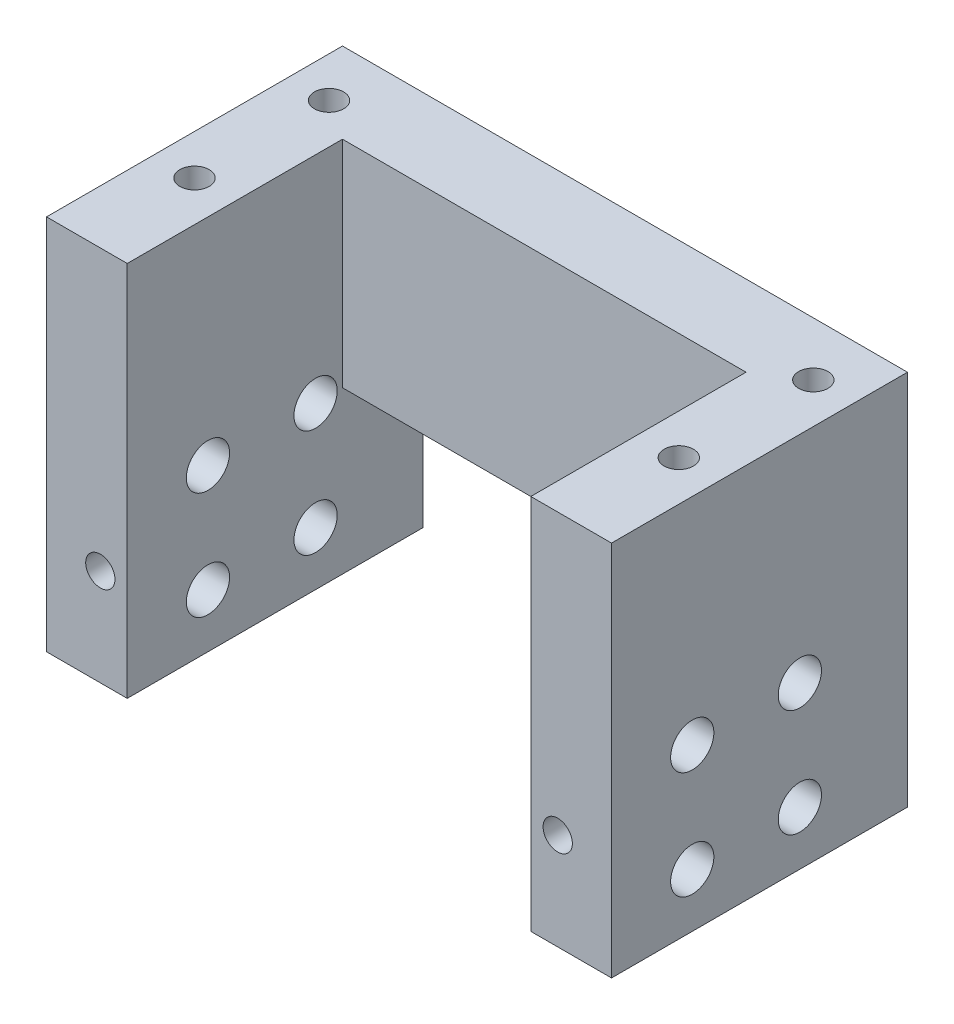
ISO-10303-21;
HEADER;
FILE_DESCRIPTION(('STEP AP214'),'2;1');
FILE_NAME('part.step','',(''),(''),'','','');
FILE_SCHEMA(('AUTOMOTIVE_DESIGN { 1 0 10303 214 1 1 1 1 }'));
ENDSEC;
DATA;
#1=APPLICATION_CONTEXT('core data for automotive mechanical design processes');
#2=APPLICATION_PROTOCOL_DEFINITION('international standard','automotive_design',2000,#1);
#3=PRODUCT_CONTEXT('',#1,'mechanical');
#4=PRODUCT('Part','Part','',(#3));
#5=PRODUCT_RELATED_PRODUCT_CATEGORY('part','',(#4));
#6=PRODUCT_DEFINITION_FORMATION('','',#4);
#7=PRODUCT_DEFINITION_CONTEXT('part definition',#1,'design');
#8=PRODUCT_DEFINITION('design','',#6,#7);
#9=PRODUCT_DEFINITION_SHAPE('','',#8);
#10=(LENGTH_UNIT() NAMED_UNIT(*) SI_UNIT(.MILLI.,.METRE.));
#11=(NAMED_UNIT(*) PLANE_ANGLE_UNIT() SI_UNIT($,.RADIAN.));
#12=(NAMED_UNIT(*) SI_UNIT($,.STERADIAN.) SOLID_ANGLE_UNIT());
#13=UNCERTAINTY_MEASURE_WITH_UNIT(LENGTH_MEASURE(1.E-05),#10,'distance_accuracy_value','');
#14=(GEOMETRIC_REPRESENTATION_CONTEXT(3) GLOBAL_UNCERTAINTY_ASSIGNED_CONTEXT((#13)) GLOBAL_UNIT_ASSIGNED_CONTEXT((#10,
#11,#12)) REPRESENTATION_CONTEXT('',''));
#15=CARTESIAN_POINT('',(0.,0.,0.));
#16=DIRECTION('',(0.,0.,1.));
#17=DIRECTION('',(1.,0.,0.));
#18=AXIS2_PLACEMENT_3D('',#15,#16,#17);
#19=CARTESIAN_POINT('',(-33.3375,-6.34999999999999,17.4625));
#20=DIRECTION('',(0.,1.,0.));
#21=DIRECTION('',(0.,0.,1.));
#22=AXIS2_PLACEMENT_3D('',#19,#20,#21);
#23=PLANE('',#22);
#24=DIRECTION('',(1.,0.,0.));
#25=VECTOR('',#24,1.);
#26=CARTESIAN_POINT('',(-33.3375,-6.34999999999999,-17.4625));
#27=LINE('',#26,#25);
#28=CARTESIAN_POINT('',(-33.3375,-6.34999999999999,-17.4625));
#29=VERTEX_POINT('',#28);
#30=CARTESIAN_POINT('',(-23.8125,-6.34999999999999,-17.4625));
#31=VERTEX_POINT('',#30);
#32=EDGE_CURVE('E257',#29,#31,#27,.T.);
#33=ORIENTED_EDGE('',*,*,#32,.T.);
#34=DIRECTION('',(0.,0.,-1.));
#35=VECTOR('',#34,1.);
#36=CARTESIAN_POINT('',(-23.8125,-6.34999999999999,17.4625));
#37=LINE('',#36,#35);
#38=CARTESIAN_POINT('',(-23.8125,-6.34999999999999,17.4625));
#39=VERTEX_POINT('',#38);
#40=EDGE_CURVE('E256',#39,#31,#37,.T.);
#41=ORIENTED_EDGE('',*,*,#40,.F.);
#42=DIRECTION('',(1.,0.,0.));
#43=VECTOR('',#42,1.);
#44=CARTESIAN_POINT('',(-33.3375,-6.34999999999999,17.4625));
#45=LINE('',#44,#43);
#46=CARTESIAN_POINT('',(-33.3375,-6.34999999999999,17.4625));
#47=VERTEX_POINT('',#46);
#48=EDGE_CURVE('E252',#47,#39,#45,.T.);
#49=ORIENTED_EDGE('',*,*,#48,.F.);
#50=DIRECTION('',(0.,0.,1.));
#51=VECTOR('',#50,1.);
#52=CARTESIAN_POINT('',(-33.3375,-6.34999999999999,17.4625));
#53=LINE('',#52,#51);
#54=EDGE_CURVE('E246',#29,#47,#53,.T.);
#55=ORIENTED_EDGE('',*,*,#54,.F.);
#56=EDGE_LOOP('',(#33,#41,#49,#55));
#57=FACE_BOUND('',#56,.T.);
#58=ADVANCED_FACE('F42',(#57),#23,.F.);
#59=CARTESIAN_POINT('',(-33.3375,38.1,17.4625));
#60=DIRECTION('',(0.,0.,-1.));
#61=DIRECTION('',(-1.,0.,0.));
#62=AXIS2_PLACEMENT_3D('',#59,#60,#61);
#63=PLANE('',#62);
#64=CARTESIAN_POINT('',(-26.9875,5.07999999999999,17.4625));
#65=DIRECTION('',(0.,0.,1.));
#66=DIRECTION('',(1.,0.,0.));
#67=AXIS2_PLACEMENT_3D('',#64,#65,#66);
#68=CIRCLE('',#67,1.72719999999999);
#69=CARTESIAN_POINT('',(-25.2603,5.07999999999999,17.4625));
#70=VERTEX_POINT('',#69);
#71=EDGE_CURVE('E161',#70,#70,#68,.T.);
#72=ORIENTED_EDGE('',*,*,#71,.F.);
#73=EDGE_LOOP('',(#72));
#74=FACE_BOUND('',#73,.T.);
#75=DIRECTION('',(0.,-1.,0.));
#76=VECTOR('',#75,1.);
#77=CARTESIAN_POINT('',(-33.3375,38.1,17.4625));
#78=LINE('',#77,#76);
#79=CARTESIAN_POINT('',(-33.3375,38.1,17.4625));
#80=VERTEX_POINT('',#79);
#81=EDGE_CURVE('E51',#80,#47,#78,.T.);
#82=ORIENTED_EDGE('',*,*,#81,.T.);
#83=ORIENTED_EDGE('',*,*,#48,.T.);
#84=DIRECTION('',(0.,1.,0.));
#85=VECTOR('',#84,1.);
#86=CARTESIAN_POINT('',(-23.8125,-38.1,17.4625));
#87=LINE('',#86,#85);
#88=CARTESIAN_POINT('',(-23.8125,38.1,17.4625));
#89=VERTEX_POINT('',#88);
#90=EDGE_CURVE('E275',#39,#89,#87,.T.);
#91=ORIENTED_EDGE('',*,*,#90,.T.);
#92=DIRECTION('',(1.,0.,0.));
#93=VECTOR('',#92,1.);
#94=CARTESIAN_POINT('',(-33.3375,38.1,17.4625));
#95=LINE('',#94,#93);
#96=EDGE_CURVE('E292',#80,#89,#95,.T.);
#97=ORIENTED_EDGE('',*,*,#96,.F.);
#98=EDGE_LOOP('',(#82,#83,#91,#97));
#99=FACE_BOUND('',#98,.T.);
#100=ADVANCED_FACE('F317',(#74,#99),#63,.F.);
#101=CARTESIAN_POINT('',(-33.3375,38.1,-17.4625));
#102=DIRECTION('',(1.,0.,0.));
#103=DIRECTION('',(0.,0.,-1.));
#104=AXIS2_PLACEMENT_3D('',#101,#102,#103);
#105=PLANE('',#104);
#106=CARTESIAN_POINT('',(-33.3375,12.7,7.9375));
#107=DIRECTION('',(-1.,0.,0.));
#108=DIRECTION('',(0.,0.,1.));
#109=AXIS2_PLACEMENT_3D('',#106,#107,#108);
#110=CIRCLE('',#109,2.55269999999999);
#111=CARTESIAN_POINT('',(-33.3375,12.7,10.4902));
#112=VERTEX_POINT('',#111);
#113=EDGE_CURVE('E361',#112,#112,#110,.T.);
#114=ORIENTED_EDGE('',*,*,#113,.F.);
#115=EDGE_LOOP('',(#114));
#116=FACE_BOUND('',#115,.T.);
#117=CARTESIAN_POINT('',(-33.3375,12.7,-4.7625));
#118=DIRECTION('',(-1.,0.,0.));
#119=DIRECTION('',(0.,0.,1.));
#120=AXIS2_PLACEMENT_3D('',#117,#118,#119);
#121=CIRCLE('',#120,2.55269999999999);
#122=CARTESIAN_POINT('',(-33.3375,12.7,-2.20980000000001));
#123=VERTEX_POINT('',#122);
#124=EDGE_CURVE('E356',#123,#123,#121,.T.);
#125=ORIENTED_EDGE('',*,*,#124,.F.);
#126=EDGE_LOOP('',(#125));
#127=FACE_BOUND('',#126,.T.);
#128=CARTESIAN_POINT('',(-33.3375,0.,7.9375));
#129=DIRECTION('',(-1.,0.,0.));
#130=DIRECTION('',(0.,0.,1.));
#131=AXIS2_PLACEMENT_3D('',#128,#129,#130);
#132=CIRCLE('',#131,2.55269999999999);
#133=CARTESIAN_POINT('',(-33.3375,0.,10.4902));
#134=VERTEX_POINT('',#133);
#135=EDGE_CURVE('E355',#134,#134,#132,.T.);
#136=ORIENTED_EDGE('',*,*,#135,.F.);
#137=EDGE_LOOP('',(#136));
#138=FACE_BOUND('',#137,.T.);
#139=CARTESIAN_POINT('',(-33.3375,0.,-4.7625));
#140=DIRECTION('',(-1.,0.,0.));
#141=DIRECTION('',(0.,0.,1.));
#142=AXIS2_PLACEMENT_3D('',#139,#140,#141);
#143=CIRCLE('',#142,2.55269999999999);
#144=CARTESIAN_POINT('',(-33.3375,0.,-2.20980000000001));
#145=VERTEX_POINT('',#144);
#146=EDGE_CURVE('E368',#145,#145,#143,.T.);
#147=ORIENTED_EDGE('',*,*,#146,.F.);
#148=EDGE_LOOP('',(#147));
#149=FACE_BOUND('',#148,.T.);
#150=DIRECTION('',(0.,-1.,0.));
#151=VECTOR('',#150,1.);
#152=CARTESIAN_POINT('',(-33.3375,38.1,-17.4625));
#153=LINE('',#152,#151);
#154=CARTESIAN_POINT('',(-33.3375,38.1,-17.4625));
#155=VERTEX_POINT('',#154);
#156=EDGE_CURVE('E302',#155,#29,#153,.T.);
#157=ORIENTED_EDGE('',*,*,#156,.T.);
#158=ORIENTED_EDGE('',*,*,#54,.T.);
#159=ORIENTED_EDGE('',*,*,#81,.F.);
#160=DIRECTION('',(0.,0.,1.));
#161=VECTOR('',#160,1.);
#162=CARTESIAN_POINT('',(-33.3375,38.1,-17.4625));
#163=LINE('',#162,#161);
#164=EDGE_CURVE('E279',#155,#80,#163,.T.);
#165=ORIENTED_EDGE('',*,*,#164,.F.);
#166=EDGE_LOOP('',(#157,#158,#159,#165));
#167=FACE_BOUND('',#166,.T.);
#168=ADVANCED_FACE('F44',(#116,#127,#138,#149,#167),#105,.F.);
#169=CARTESIAN_POINT('',(26.9875,5.07999999999999,17.4625));
#170=DIRECTION('',(0.,0.,1.));
#171=DIRECTION('',(1.,0.,0.));
#172=AXIS2_PLACEMENT_3D('',#169,#170,#171);
#173=CIRCLE('',#172,1.72719999999999);
#174=CARTESIAN_POINT('',(28.7147,5.07999999999999,17.4625));
#175=VERTEX_POINT('',#174);
#176=EDGE_CURVE('E200',#175,#175,#173,.T.);
#177=ORIENTED_EDGE('',*,*,#176,.F.);
#178=EDGE_LOOP('',(#177));
#179=FACE_BOUND('',#178,.T.);
#180=DIRECTION('',(0.,1.,0.));
#181=VECTOR('',#180,1.);
#182=CARTESIAN_POINT('',(23.8125,-38.1,17.4625));
#183=LINE('',#182,#181);
#184=CARTESIAN_POINT('',(23.8125,-6.35000000000001,17.4625));
#185=VERTEX_POINT('',#184);
#186=CARTESIAN_POINT('',(23.8125,38.1,17.4625));
#187=VERTEX_POINT('',#186);
#188=EDGE_CURVE('E283',#185,#187,#183,.T.);
#189=ORIENTED_EDGE('',*,*,#188,.F.);
#190=CARTESIAN_POINT('',(33.3375,-6.34999999999999,17.4625));
#191=VERTEX_POINT('',#190);
#192=EDGE_CURVE('E61',#185,#191,#45,.T.);
#193=ORIENTED_EDGE('',*,*,#192,.T.);
#194=DIRECTION('',(0.,-1.,0.));
#195=VECTOR('',#194,1.);
#196=CARTESIAN_POINT('',(33.3375,38.1,17.4625));
#197=LINE('',#196,#195);
#198=CARTESIAN_POINT('',(33.3375,38.1,17.4625));
#199=VERTEX_POINT('',#198);
#200=EDGE_CURVE('E310',#199,#191,#197,.T.);
#201=ORIENTED_EDGE('',*,*,#200,.F.);
#202=EDGE_CURVE('E291',#187,#199,#95,.T.);
#203=ORIENTED_EDGE('',*,*,#202,.F.);
#204=EDGE_LOOP('',(#189,#193,#201,#203));
#205=FACE_BOUND('',#204,.T.);
#206=ADVANCED_FACE('F348',(#179,#205),#63,.F.);
#207=CARTESIAN_POINT('',(33.3375,38.1,-17.4625));
#208=DIRECTION('',(-1.,0.,0.));
#209=DIRECTION('',(0.,0.,1.));
#210=AXIS2_PLACEMENT_3D('',#207,#208,#209);
#211=PLANE('',#210);
#212=CARTESIAN_POINT('',(33.3375,12.7,-4.7625));
#213=DIRECTION('',(1.,0.,0.));
#214=DIRECTION('',(0.,0.,-1.));
#215=AXIS2_PLACEMENT_3D('',#212,#213,#214);
#216=CIRCLE('',#215,2.55269999999999);
#217=CARTESIAN_POINT('',(33.3375,12.7,-7.31519999999999));
#218=VERTEX_POINT('',#217);
#219=EDGE_CURVE('E173',#218,#218,#216,.T.);
#220=ORIENTED_EDGE('',*,*,#219,.F.);
#221=EDGE_LOOP('',(#220));
#222=FACE_BOUND('',#221,.T.);
#223=CARTESIAN_POINT('',(33.3375,12.7,7.9375));
#224=DIRECTION('',(1.,0.,0.));
#225=DIRECTION('',(0.,0.,-1.));
#226=AXIS2_PLACEMENT_3D('',#223,#224,#225);
#227=CIRCLE('',#226,2.55269999999999);
#228=CARTESIAN_POINT('',(33.3375,12.7,5.38480000000001));
#229=VERTEX_POINT('',#228);
#230=EDGE_CURVE('E181',#229,#229,#227,.T.);
#231=ORIENTED_EDGE('',*,*,#230,.F.);
#232=EDGE_LOOP('',(#231));
#233=FACE_BOUND('',#232,.T.);
#234=CARTESIAN_POINT('',(33.3375,0.,7.9375));
#235=DIRECTION('',(1.,0.,0.));
#236=DIRECTION('',(0.,0.,-1.));
#237=AXIS2_PLACEMENT_3D('',#234,#235,#236);
#238=CIRCLE('',#237,2.55269999999999);
#239=CARTESIAN_POINT('',(33.3375,0.,5.38480000000001));
#240=VERTEX_POINT('',#239);
#241=EDGE_CURVE('E208',#240,#240,#238,.T.);
#242=ORIENTED_EDGE('',*,*,#241,.F.);
#243=EDGE_LOOP('',(#242));
#244=FACE_BOUND('',#243,.T.);
#245=CARTESIAN_POINT('',(33.3375,0.,-4.7625));
#246=DIRECTION('',(1.,0.,0.));
#247=DIRECTION('',(0.,0.,-1.));
#248=AXIS2_PLACEMENT_3D('',#245,#246,#247);
#249=CIRCLE('',#248,2.55269999999999);
#250=CARTESIAN_POINT('',(33.3375,0.,-7.31519999999998));
#251=VERTEX_POINT('',#250);
#252=EDGE_CURVE('E216',#251,#251,#249,.T.);
#253=ORIENTED_EDGE('',*,*,#252,.F.);
#254=EDGE_LOOP('',(#253));
#255=FACE_BOUND('',#254,.T.);
#256=ORIENTED_EDGE('',*,*,#200,.T.);
#257=DIRECTION('',(0.,0.,1.));
#258=VECTOR('',#257,1.);
#259=CARTESIAN_POINT('',(33.3375,-6.34999999999999,17.4625));
#260=LINE('',#259,#258);
#261=CARTESIAN_POINT('',(33.3375,-6.34999999999999,-17.4625));
#262=VERTEX_POINT('',#261);
#263=EDGE_CURVE('E245',#262,#191,#260,.T.);
#264=ORIENTED_EDGE('',*,*,#263,.F.);
#265=DIRECTION('',(0.,-1.,0.));
#266=VECTOR('',#265,1.);
#267=CARTESIAN_POINT('',(33.3375,38.1,-17.4625));
#268=LINE('',#267,#266);
#269=CARTESIAN_POINT('',(33.3375,38.1,-17.4625));
#270=VERTEX_POINT('',#269);
#271=EDGE_CURVE('E306',#270,#262,#268,.T.);
#272=ORIENTED_EDGE('',*,*,#271,.F.);
#273=DIRECTION('',(0.,0.,-1.));
#274=VECTOR('',#273,1.);
#275=CARTESIAN_POINT('',(33.3375,38.1,-17.4625));
#276=LINE('',#275,#274);
#277=EDGE_CURVE('E296',#199,#270,#276,.T.);
#278=ORIENTED_EDGE('',*,*,#277,.F.);
#279=EDGE_LOOP('',(#256,#264,#272,#278));
#280=FACE_BOUND('',#279,.T.);
#281=ADVANCED_FACE('F343',(#222,#233,#244,#255,#280),#211,.F.);
#282=CARTESIAN_POINT('',(-33.3375,38.1,-17.4625));
#283=DIRECTION('',(0.,0.,1.));
#284=DIRECTION('',(1.,0.,0.));
#285=AXIS2_PLACEMENT_3D('',#282,#283,#284);
#286=PLANE('',#285);
#287=DIRECTION('',(1.,0.,0.));
#288=VECTOR('',#287,1.);
#289=CARTESIAN_POINT('',(-23.8125,12.7,-17.4625));
#290=LINE('',#289,#288);
#291=CARTESIAN_POINT('',(-23.8125,12.7,-17.4625));
#292=VERTEX_POINT('',#291);
#293=CARTESIAN_POINT('',(23.8125,12.7,-17.4625));
#294=VERTEX_POINT('',#293);
#295=EDGE_CURVE('E228',#292,#294,#290,.T.);
#296=ORIENTED_EDGE('',*,*,#295,.F.);
#297=DIRECTION('',(0.,1.,0.));
#298=VECTOR('',#297,1.);
#299=CARTESIAN_POINT('',(-23.8125,12.7,-17.4625));
#300=LINE('',#299,#298);
#301=EDGE_CURVE('E224',#31,#292,#300,.T.);
#302=ORIENTED_EDGE('',*,*,#301,.F.);
#303=ORIENTED_EDGE('',*,*,#32,.F.);
#304=ORIENTED_EDGE('',*,*,#156,.F.);
#305=DIRECTION('',(-1.,0.,0.));
#306=VECTOR('',#305,1.);
#307=CARTESIAN_POINT('',(-33.3375,38.1,-17.4625));
#308=LINE('',#307,#306);
#309=EDGE_CURVE('E299',#270,#155,#308,.T.);
#310=ORIENTED_EDGE('',*,*,#309,.F.);
#311=ORIENTED_EDGE('',*,*,#271,.T.);
#312=CARTESIAN_POINT('',(23.8125,-6.34999999999999,-17.4625));
#313=VERTEX_POINT('',#312);
#314=EDGE_CURVE('E249',#313,#262,#27,.T.);
#315=ORIENTED_EDGE('',*,*,#314,.F.);
#316=DIRECTION('',(0.,-1.,0.));
#317=VECTOR('',#316,1.);
#318=CARTESIAN_POINT('',(23.8125,12.7,-17.4625));
#319=LINE('',#318,#317);
#320=EDGE_CURVE('E232',#294,#313,#319,.T.);
#321=ORIENTED_EDGE('',*,*,#320,.F.);
#322=EDGE_LOOP('',(#296,#302,#303,#304,#310,#311,#315,#321));
#323=FACE_BOUND('',#322,.T.);
#324=ADVANCED_FACE('F327',(#323),#286,.F.);
#325=CARTESIAN_POINT('',(0.,38.1,0.));
#326=DIRECTION('',(0.,1.,0.));
#327=DIRECTION('',(0.,0.,1.));
#328=AXIS2_PLACEMENT_3D('',#325,#326,#327);
#329=PLANE('',#328);
#330=CARTESIAN_POINT('',(-28.575,38.1,4.7625));
#331=DIRECTION('',(0.,1.,0.));
#332=DIRECTION('',(0.,0.,1.));
#333=AXIS2_PLACEMENT_3D('',#330,#331,#332);
#334=CIRCLE('',#333,1.72719999999999);
#335=CARTESIAN_POINT('',(-28.575,38.1,6.48969999999999));
#336=VERTEX_POINT('',#335);
#337=EDGE_CURVE('E144',#336,#336,#334,.T.);
#338=ORIENTED_EDGE('',*,*,#337,.F.);
#339=EDGE_LOOP('',(#338));
#340=FACE_BOUND('',#339,.T.);
#341=CARTESIAN_POINT('',(-28.575,38.1,-11.1125));
#342=DIRECTION('',(0.,1.,0.));
#343=DIRECTION('',(0.,0.,1.));
#344=AXIS2_PLACEMENT_3D('',#341,#342,#343);
#345=CIRCLE('',#344,1.72719999999999);
#346=CARTESIAN_POINT('',(-28.575,38.1,-9.38530000000001));
#347=VERTEX_POINT('',#346);
#348=EDGE_CURVE('E143',#347,#347,#345,.T.);
#349=ORIENTED_EDGE('',*,*,#348,.F.);
#350=EDGE_LOOP('',(#349));
#351=FACE_BOUND('',#350,.T.);
#352=CARTESIAN_POINT('',(28.575,38.1,4.7625));
#353=DIRECTION('',(0.,1.,0.));
#354=DIRECTION('',(0.,0.,1.));
#355=AXIS2_PLACEMENT_3D('',#352,#353,#354);
#356=CIRCLE('',#355,1.72719999999999);
#357=CARTESIAN_POINT('',(28.575,38.1,6.48969999999999));
#358=VERTEX_POINT('',#357);
#359=EDGE_CURVE('E185',#358,#358,#356,.T.);
#360=ORIENTED_EDGE('',*,*,#359,.F.);
#361=EDGE_LOOP('',(#360));
#362=FACE_BOUND('',#361,.T.);
#363=CARTESIAN_POINT('',(28.575,38.1,-11.1125));
#364=DIRECTION('',(0.,1.,0.));
#365=DIRECTION('',(0.,0.,1.));
#366=AXIS2_PLACEMENT_3D('',#363,#364,#365);
#367=CIRCLE('',#366,1.72719999999999);
#368=CARTESIAN_POINT('',(28.575,38.1,-9.38530000000001));
#369=VERTEX_POINT('',#368);
#370=EDGE_CURVE('E193',#369,#369,#367,.T.);
#371=ORIENTED_EDGE('',*,*,#370,.F.);
#372=EDGE_LOOP('',(#371));
#373=FACE_BOUND('',#372,.T.);
#374=DIRECTION('',(0.,0.,1.));
#375=VECTOR('',#374,1.);
#376=CARTESIAN_POINT('',(-23.8125,38.1,17.4625));
#377=LINE('',#376,#375);
#378=CARTESIAN_POINT('',(-23.8125,38.1,-7.9375));
#379=VERTEX_POINT('',#378);
#380=EDGE_CURVE('E263',#379,#89,#377,.T.);
#381=ORIENTED_EDGE('',*,*,#380,.F.);
#382=DIRECTION('',(-1.,0.,0.));
#383=VECTOR('',#382,1.);
#384=CARTESIAN_POINT('',(-23.8125,38.1,-7.9375));
#385=LINE('',#384,#383);
#386=CARTESIAN_POINT('',(23.8125,38.1,-7.9375));
#387=VERTEX_POINT('',#386);
#388=EDGE_CURVE('E271',#387,#379,#385,.T.);
#389=ORIENTED_EDGE('',*,*,#388,.F.);
#390=DIRECTION('',(0.,0.,-1.));
#391=VECTOR('',#390,1.);
#392=CARTESIAN_POINT('',(23.8125,38.1,17.4625));
#393=LINE('',#392,#391);
#394=EDGE_CURVE('E267',#187,#387,#393,.T.);
#395=ORIENTED_EDGE('',*,*,#394,.F.);
#396=ORIENTED_EDGE('',*,*,#202,.T.);
#397=ORIENTED_EDGE('',*,*,#277,.T.);
#398=ORIENTED_EDGE('',*,*,#309,.T.);
#399=ORIENTED_EDGE('',*,*,#164,.T.);
#400=ORIENTED_EDGE('',*,*,#96,.T.);
#401=EDGE_LOOP('',(#381,#389,#395,#396,#397,#398,#399,#400));
#402=FACE_BOUND('',#401,.T.);
#403=ADVANCED_FACE('F337',(#340,#351,#362,#373,#402),#329,.T.);
#404=CARTESIAN_POINT('',(-23.8125,-38.1,17.4625));
#405=DIRECTION('',(-1.,0.,0.));
#406=DIRECTION('',(0.,0.,1.));
#407=AXIS2_PLACEMENT_3D('',#404,#405,#406);
#408=PLANE('',#407);
#409=CARTESIAN_POINT('',(-23.8125,12.7,7.9375));
#410=DIRECTION('',(-1.,0.,0.));
#411=DIRECTION('',(0.,0.,1.));
#412=AXIS2_PLACEMENT_3D('',#409,#410,#411);
#413=CIRCLE('',#412,2.55269999999999);
#414=CARTESIAN_POINT('',(-23.8125,12.7,10.4902));
#415=VERTEX_POINT('',#414);
#416=EDGE_CURVE('E359',#415,#415,#413,.T.);
#417=ORIENTED_EDGE('',*,*,#416,.T.);
#418=EDGE_LOOP('',(#417));
#419=FACE_BOUND('',#418,.T.);
#420=CARTESIAN_POINT('',(-23.8125,12.7,-4.7625));
#421=DIRECTION('',(-1.,0.,0.));
#422=DIRECTION('',(0.,0.,1.));
#423=AXIS2_PLACEMENT_3D('',#420,#421,#422);
#424=CIRCLE('',#423,2.55269999999999);
#425=CARTESIAN_POINT('',(-23.8125,12.7,-2.20980000000001));
#426=VERTEX_POINT('',#425);
#427=EDGE_CURVE('E353',#426,#426,#424,.T.);
#428=ORIENTED_EDGE('',*,*,#427,.T.);
#429=EDGE_LOOP('',(#428));
#430=FACE_BOUND('',#429,.T.);
#431=CARTESIAN_POINT('',(-23.8125,0.,7.9375));
#432=DIRECTION('',(-1.,0.,0.));
#433=DIRECTION('',(0.,0.,1.));
#434=AXIS2_PLACEMENT_3D('',#431,#432,#433);
#435=CIRCLE('',#434,2.55269999999999);
#436=CARTESIAN_POINT('',(-23.8125,0.,10.4902));
#437=VERTEX_POINT('',#436);
#438=EDGE_CURVE('E371',#437,#437,#435,.T.);
#439=ORIENTED_EDGE('',*,*,#438,.T.);
#440=EDGE_LOOP('',(#439));
#441=FACE_BOUND('',#440,.T.);
#442=CARTESIAN_POINT('',(-23.8125,0.,-4.7625));
#443=DIRECTION('',(-1.,0.,0.));
#444=DIRECTION('',(0.,0.,1.));
#445=AXIS2_PLACEMENT_3D('',#442,#443,#444);
#446=CIRCLE('',#445,2.55269999999999);
#447=CARTESIAN_POINT('',(-23.8125,0.,-2.20980000000001));
#448=VERTEX_POINT('',#447);
#449=EDGE_CURVE('E154',#448,#448,#446,.T.);
#450=ORIENTED_EDGE('',*,*,#449,.T.);
#451=EDGE_LOOP('',(#450));
#452=FACE_BOUND('',#451,.T.);
#453=ORIENTED_EDGE('',*,*,#380,.T.);
#454=ORIENTED_EDGE('',*,*,#90,.F.);
#455=ORIENTED_EDGE('',*,*,#40,.T.);
#456=ORIENTED_EDGE('',*,*,#301,.T.);
#457=DIRECTION('',(0.,0.,-1.));
#458=VECTOR('',#457,1.);
#459=CARTESIAN_POINT('',(-23.8125,12.7,17.4625));
#460=LINE('',#459,#458);
#461=CARTESIAN_POINT('',(-23.8125,12.7,-7.9375));
#462=VERTEX_POINT('',#461);
#463=EDGE_CURVE('E235',#462,#292,#460,.T.);
#464=ORIENTED_EDGE('',*,*,#463,.F.);
#465=DIRECTION('',(0.,1.,0.));
#466=VECTOR('',#465,1.);
#467=CARTESIAN_POINT('',(-23.8125,-38.1,-7.9375));
#468=LINE('',#467,#466);
#469=EDGE_CURVE('E276',#462,#379,#468,.T.);
#470=ORIENTED_EDGE('',*,*,#469,.T.);
#471=EDGE_LOOP('',(#453,#454,#455,#456,#464,#470));
#472=FACE_BOUND('',#471,.T.);
#473=ADVANCED_FACE('F332',(#419,#430,#441,#452,#472),#408,.F.);
#474=CARTESIAN_POINT('',(-23.8125,-38.1,-7.9375));
#475=DIRECTION('',(0.,0.,-1.));
#476=DIRECTION('',(-1.,0.,0.));
#477=AXIS2_PLACEMENT_3D('',#474,#475,#476);
#478=PLANE('',#477);
#479=ORIENTED_EDGE('',*,*,#469,.F.);
#480=DIRECTION('',(1.,0.,0.));
#481=VECTOR('',#480,1.);
#482=CARTESIAN_POINT('',(-23.8125,12.7,-7.9375));
#483=LINE('',#482,#481);
#484=CARTESIAN_POINT('',(23.8125,12.7,-7.9375));
#485=VERTEX_POINT('',#484);
#486=EDGE_CURVE('E239',#462,#485,#483,.T.);
#487=ORIENTED_EDGE('',*,*,#486,.T.);
#488=DIRECTION('',(0.,1.,0.));
#489=VECTOR('',#488,1.);
#490=CARTESIAN_POINT('',(23.8125,-38.1,-7.9375));
#491=LINE('',#490,#489);
#492=EDGE_CURVE('E280',#485,#387,#491,.T.);
#493=ORIENTED_EDGE('',*,*,#492,.T.);
#494=ORIENTED_EDGE('',*,*,#388,.T.);
#495=EDGE_LOOP('',(#479,#487,#493,#494));
#496=FACE_BOUND('',#495,.T.);
#497=ADVANCED_FACE('F426',(#496),#478,.F.);
#498=CARTESIAN_POINT('',(23.8125,-38.1,17.4625));
#499=DIRECTION('',(1.,0.,0.));
#500=DIRECTION('',(0.,0.,-1.));
#501=AXIS2_PLACEMENT_3D('',#498,#499,#500);
#502=PLANE('',#501);
#503=CARTESIAN_POINT('',(23.8125,12.7,-4.7625));
#504=DIRECTION('',(1.,0.,0.));
#505=DIRECTION('',(0.,0.,-1.));
#506=AXIS2_PLACEMENT_3D('',#503,#504,#505);
#507=CIRCLE('',#506,2.55269999999999);
#508=CARTESIAN_POINT('',(23.8125,12.7,-7.31519999999999));
#509=VERTEX_POINT('',#508);
#510=EDGE_CURVE('E169',#509,#509,#507,.T.);
#511=ORIENTED_EDGE('',*,*,#510,.T.);
#512=EDGE_LOOP('',(#511));
#513=FACE_BOUND('',#512,.T.);
#514=CARTESIAN_POINT('',(23.8125,12.7,7.9375));
#515=DIRECTION('',(1.,0.,0.));
#516=DIRECTION('',(0.,0.,-1.));
#517=AXIS2_PLACEMENT_3D('',#514,#515,#516);
#518=CIRCLE('',#517,2.55269999999999);
#519=CARTESIAN_POINT('',(23.8125,12.7,5.38480000000001));
#520=VERTEX_POINT('',#519);
#521=EDGE_CURVE('E177',#520,#520,#518,.T.);
#522=ORIENTED_EDGE('',*,*,#521,.T.);
#523=EDGE_LOOP('',(#522));
#524=FACE_BOUND('',#523,.T.);
#525=CARTESIAN_POINT('',(23.8125,0.,7.9375));
#526=DIRECTION('',(1.,0.,0.));
#527=DIRECTION('',(0.,0.,-1.));
#528=AXIS2_PLACEMENT_3D('',#525,#526,#527);
#529=CIRCLE('',#528,2.55269999999999);
#530=CARTESIAN_POINT('',(23.8125,0.,5.38480000000001));
#531=VERTEX_POINT('',#530);
#532=EDGE_CURVE('E212',#531,#531,#529,.T.);
#533=ORIENTED_EDGE('',*,*,#532,.T.);
#534=EDGE_LOOP('',(#533));
#535=FACE_BOUND('',#534,.T.);
#536=CARTESIAN_POINT('',(23.8125,0.,-4.7625));
#537=DIRECTION('',(1.,0.,0.));
#538=DIRECTION('',(0.,0.,-1.));
#539=AXIS2_PLACEMENT_3D('',#536,#537,#538);
#540=CIRCLE('',#539,2.55269999999999);
#541=CARTESIAN_POINT('',(23.8125,0.,-7.31519999999999));
#542=VERTEX_POINT('',#541);
#543=EDGE_CURVE('E220',#542,#542,#540,.T.);
#544=ORIENTED_EDGE('',*,*,#543,.T.);
#545=EDGE_LOOP('',(#544));
#546=FACE_BOUND('',#545,.T.);
#547=ORIENTED_EDGE('',*,*,#492,.F.);
#548=DIRECTION('',(0.,0.,-1.));
#549=VECTOR('',#548,1.);
#550=CARTESIAN_POINT('',(23.8125,12.7,17.4625));
#551=LINE('',#550,#549);
#552=EDGE_CURVE('E236',#485,#294,#551,.T.);
#553=ORIENTED_EDGE('',*,*,#552,.T.);
#554=ORIENTED_EDGE('',*,*,#320,.T.);
#555=DIRECTION('',(0.,0.,1.));
#556=VECTOR('',#555,1.);
#557=CARTESIAN_POINT('',(23.8125,-6.34999999999999,17.4625));
#558=LINE('',#557,#556);
#559=EDGE_CURVE('E11',#313,#185,#558,.T.);
#560=ORIENTED_EDGE('',*,*,#559,.T.);
#561=ORIENTED_EDGE('',*,*,#188,.T.);
#562=ORIENTED_EDGE('',*,*,#394,.T.);
#563=EDGE_LOOP('',(#547,#553,#554,#560,#561,#562));
#564=FACE_BOUND('',#563,.T.);
#565=ADVANCED_FACE('F419',(#513,#524,#535,#546,#564),#502,.F.);
#566=ORIENTED_EDGE('',*,*,#559,.F.);
#567=ORIENTED_EDGE('',*,*,#314,.T.);
#568=ORIENTED_EDGE('',*,*,#263,.T.);
#569=ORIENTED_EDGE('',*,*,#192,.F.);
#570=EDGE_LOOP('',(#566,#567,#568,#569));
#571=FACE_BOUND('',#570,.T.);
#572=ADVANCED_FACE('F345',(#571),#23,.F.);
#573=CARTESIAN_POINT('',(-23.8125,12.7,17.4625));
#574=DIRECTION('',(0.,1.,0.));
#575=DIRECTION('',(-1.,0.,0.));
#576=AXIS2_PLACEMENT_3D('',#573,#574,#575);
#577=PLANE('',#576);
#578=ORIENTED_EDGE('',*,*,#463,.T.);
#579=ORIENTED_EDGE('',*,*,#295,.T.);
#580=ORIENTED_EDGE('',*,*,#552,.F.);
#581=ORIENTED_EDGE('',*,*,#486,.F.);
#582=EDGE_LOOP('',(#578,#579,#580,#581));
#583=FACE_BOUND('',#582,.T.);
#584=ADVANCED_FACE('F418',(#583),#577,.F.);
#585=CARTESIAN_POINT('',(33.3375,0.,-4.7625));
#586=DIRECTION('',(1.,0.,0.));
#587=DIRECTION('',(0.,0.,-1.));
#588=AXIS2_PLACEMENT_3D('',#585,#586,#587);
#589=CYLINDRICAL_SURFACE('',#588,2.55269999999999);
#590=ORIENTED_EDGE('',*,*,#543,.F.);
#591=EDGE_LOOP('',(#590));
#592=FACE_BOUND('',#591,.T.);
#593=ORIENTED_EDGE('',*,*,#252,.T.);
#594=EDGE_LOOP('',(#593));
#595=FACE_BOUND('',#594,.T.);
#596=ADVANCED_FACE('F424',(#592,#595),#589,.F.);
#597=CARTESIAN_POINT('',(33.3375,0.,7.9375));
#598=DIRECTION('',(1.,0.,0.));
#599=DIRECTION('',(0.,0.,-1.));
#600=AXIS2_PLACEMENT_3D('',#597,#598,#599);
#601=CYLINDRICAL_SURFACE('',#600,2.55269999999999);
#602=ORIENTED_EDGE('',*,*,#532,.F.);
#603=EDGE_LOOP('',(#602));
#604=FACE_BOUND('',#603,.T.);
#605=ORIENTED_EDGE('',*,*,#241,.T.);
#606=EDGE_LOOP('',(#605));
#607=FACE_BOUND('',#606,.T.);
#608=ADVANCED_FACE('F464',(#604,#607),#601,.F.);
#609=CARTESIAN_POINT('',(26.9875,5.07999999999999,5.0165));
#610=DIRECTION('',(0.,0.,1.));
#611=DIRECTION('',(1.,0.,0.));
#612=AXIS2_PLACEMENT_3D('',#609,#610,#611);
#613=CONICAL_SURFACE('',#612,1.72719999999999,1.02974425867665);
#614=CARTESIAN_POINT('',(26.9875,5.07999999999999,3.9786935388156));
#615=VERTEX_POINT('',#614);
#616=VERTEX_LOOP('',#615);
#617=FACE_BOUND('',#616,.T.);
#618=CARTESIAN_POINT('',(26.9875,5.07999999999999,5.0165));
#619=DIRECTION('',(0.,0.,1.));
#620=DIRECTION('',(1.,0.,0.));
#621=AXIS2_PLACEMENT_3D('',#618,#619,#620);
#622=CIRCLE('',#621,1.72719999999999);
#623=CARTESIAN_POINT('',(28.7147,5.07999999999999,5.0165));
#624=VERTEX_POINT('',#623);
#625=EDGE_CURVE('E204',#624,#624,#622,.T.);
#626=ORIENTED_EDGE('',*,*,#625,.T.);
#627=EDGE_LOOP('',(#626));
#628=FACE_BOUND('',#627,.T.);
#629=ADVANCED_FACE('F454',(#617,#628),#613,.F.);
#630=CARTESIAN_POINT('',(26.9875,5.07999999999999,17.4625));
#631=DIRECTION('',(0.,0.,1.));
#632=DIRECTION('',(1.,0.,0.));
#633=AXIS2_PLACEMENT_3D('',#630,#631,#632);
#634=CYLINDRICAL_SURFACE('',#633,1.72719999999999);
#635=ORIENTED_EDGE('',*,*,#625,.F.);
#636=EDGE_LOOP('',(#635));
#637=FACE_BOUND('',#636,.T.);
#638=ORIENTED_EDGE('',*,*,#176,.T.);
#639=EDGE_LOOP('',(#638));
#640=FACE_BOUND('',#639,.T.);
#641=ADVANCED_FACE('F451',(#637,#640),#634,.F.);
#642=CARTESIAN_POINT('',(28.575,25.654,-11.1125));
#643=DIRECTION('',(0.,1.,0.));
#644=DIRECTION('',(0.,0.,1.));
#645=AXIS2_PLACEMENT_3D('',#642,#643,#644);
#646=CONICAL_SURFACE('',#645,1.72719999999999,1.02974425867665);
#647=CARTESIAN_POINT('',(28.575,24.6161935388156,-11.1125));
#648=VERTEX_POINT('',#647);
#649=VERTEX_LOOP('',#648);
#650=FACE_BOUND('',#649,.T.);
#651=CARTESIAN_POINT('',(28.575,25.654,-11.1125));
#652=DIRECTION('',(0.,1.,0.));
#653=DIRECTION('',(0.,0.,1.));
#654=AXIS2_PLACEMENT_3D('',#651,#652,#653);
#655=CIRCLE('',#654,1.72719999999999);
#656=CARTESIAN_POINT('',(28.575,25.654,-9.38530000000001));
#657=VERTEX_POINT('',#656);
#658=EDGE_CURVE('E196',#657,#657,#655,.T.);
#659=ORIENTED_EDGE('',*,*,#658,.T.);
#660=EDGE_LOOP('',(#659));
#661=FACE_BOUND('',#660,.T.);
#662=ADVANCED_FACE('F453',(#650,#661),#646,.F.);
#663=CARTESIAN_POINT('',(28.575,38.1,-11.1125));
#664=DIRECTION('',(0.,1.,0.));
#665=DIRECTION('',(0.,0.,1.));
#666=AXIS2_PLACEMENT_3D('',#663,#664,#665);
#667=CYLINDRICAL_SURFACE('',#666,1.72719999999999);
#668=ORIENTED_EDGE('',*,*,#658,.F.);
#669=EDGE_LOOP('',(#668));
#670=FACE_BOUND('',#669,.T.);
#671=ORIENTED_EDGE('',*,*,#370,.T.);
#672=EDGE_LOOP('',(#671));
#673=FACE_BOUND('',#672,.T.);
#674=ADVANCED_FACE('F461',(#670,#673),#667,.F.);
#675=CARTESIAN_POINT('',(28.575,25.654,4.7625));
#676=DIRECTION('',(0.,1.,0.));
#677=DIRECTION('',(0.,0.,1.));
#678=AXIS2_PLACEMENT_3D('',#675,#676,#677);
#679=CONICAL_SURFACE('',#678,1.72719999999999,1.02974425867665);
#680=CARTESIAN_POINT('',(28.575,24.6161935388156,4.7625));
#681=VERTEX_POINT('',#680);
#682=VERTEX_LOOP('',#681);
#683=FACE_BOUND('',#682,.T.);
#684=CARTESIAN_POINT('',(28.575,25.654,4.7625));
#685=DIRECTION('',(0.,1.,0.));
#686=DIRECTION('',(0.,0.,1.));
#687=AXIS2_PLACEMENT_3D('',#684,#685,#686);
#688=CIRCLE('',#687,1.72719999999999);
#689=CARTESIAN_POINT('',(28.575,25.654,6.48969999999999));
#690=VERTEX_POINT('',#689);
#691=EDGE_CURVE('E189',#690,#690,#688,.T.);
#692=ORIENTED_EDGE('',*,*,#691,.T.);
#693=EDGE_LOOP('',(#692));
#694=FACE_BOUND('',#693,.T.);
#695=ADVANCED_FACE('F514',(#683,#694),#679,.F.);
#696=CARTESIAN_POINT('',(28.575,38.1,4.7625));
#697=DIRECTION('',(0.,1.,0.));
#698=DIRECTION('',(0.,0.,1.));
#699=AXIS2_PLACEMENT_3D('',#696,#697,#698);
#700=CYLINDRICAL_SURFACE('',#699,1.72719999999999);
#701=ORIENTED_EDGE('',*,*,#691,.F.);
#702=EDGE_LOOP('',(#701));
#703=FACE_BOUND('',#702,.T.);
#704=ORIENTED_EDGE('',*,*,#359,.T.);
#705=EDGE_LOOP('',(#704));
#706=FACE_BOUND('',#705,.T.);
#707=ADVANCED_FACE('F523',(#703,#706),#700,.F.);
#708=CARTESIAN_POINT('',(33.3375,12.7,7.9375));
#709=DIRECTION('',(1.,0.,0.));
#710=DIRECTION('',(0.,0.,-1.));
#711=AXIS2_PLACEMENT_3D('',#708,#709,#710);
#712=CYLINDRICAL_SURFACE('',#711,2.55269999999999);
#713=ORIENTED_EDGE('',*,*,#521,.F.);
#714=EDGE_LOOP('',(#713));
#715=FACE_BOUND('',#714,.T.);
#716=ORIENTED_EDGE('',*,*,#230,.T.);
#717=EDGE_LOOP('',(#716));
#718=FACE_BOUND('',#717,.T.);
#719=ADVANCED_FACE('F533',(#715,#718),#712,.F.);
#720=CARTESIAN_POINT('',(33.3375,12.7,-4.7625));
#721=DIRECTION('',(1.,0.,0.));
#722=DIRECTION('',(0.,0.,-1.));
#723=AXIS2_PLACEMENT_3D('',#720,#721,#722);
#724=CYLINDRICAL_SURFACE('',#723,2.55269999999999);
#725=ORIENTED_EDGE('',*,*,#510,.F.);
#726=EDGE_LOOP('',(#725));
#727=FACE_BOUND('',#726,.T.);
#728=ORIENTED_EDGE('',*,*,#219,.T.);
#729=EDGE_LOOP('',(#728));
#730=FACE_BOUND('',#729,.T.);
#731=ADVANCED_FACE('F542',(#727,#730),#724,.F.);
#732=CARTESIAN_POINT('',(-26.9875,5.07999999999999,5.0165));
#733=DIRECTION('',(0.,0.,1.));
#734=DIRECTION('',(1.,0.,0.));
#735=AXIS2_PLACEMENT_3D('',#732,#733,#734);
#736=CONICAL_SURFACE('',#735,1.72719999999999,1.02974425867665);
#737=CARTESIAN_POINT('',(-26.9875,5.07999999999999,3.9786935388156));
#738=VERTEX_POINT('',#737);
#739=VERTEX_LOOP('',#738);
#740=FACE_BOUND('',#739,.T.);
#741=CARTESIAN_POINT('',(-26.9875,5.07999999999999,5.0165));
#742=DIRECTION('',(0.,0.,1.));
#743=DIRECTION('',(1.,0.,0.));
#744=AXIS2_PLACEMENT_3D('',#741,#742,#743);
#745=CIRCLE('',#744,1.72719999999999);
#746=CARTESIAN_POINT('',(-25.2603,5.07999999999999,5.0165));
#747=VERTEX_POINT('',#746);
#748=EDGE_CURVE('E165',#747,#747,#745,.T.);
#749=ORIENTED_EDGE('',*,*,#748,.T.);
#750=EDGE_LOOP('',(#749));
#751=FACE_BOUND('',#750,.T.);
#752=ADVANCED_FACE('F551',(#740,#751),#736,.F.);
#753=CARTESIAN_POINT('',(-26.9875,5.07999999999999,17.4625));
#754=DIRECTION('',(0.,0.,1.));
#755=DIRECTION('',(1.,0.,0.));
#756=AXIS2_PLACEMENT_3D('',#753,#754,#755);
#757=CYLINDRICAL_SURFACE('',#756,1.72719999999999);
#758=ORIENTED_EDGE('',*,*,#748,.F.);
#759=EDGE_LOOP('',(#758));
#760=FACE_BOUND('',#759,.T.);
#761=ORIENTED_EDGE('',*,*,#71,.T.);
#762=EDGE_LOOP('',(#761));
#763=FACE_BOUND('',#762,.T.);
#764=ADVANCED_FACE('F561',(#760,#763),#757,.F.);
#765=CARTESIAN_POINT('',(-28.575,25.654,-11.1125));
#766=DIRECTION('',(0.,1.,0.));
#767=DIRECTION('',(0.,0.,1.));
#768=AXIS2_PLACEMENT_3D('',#765,#766,#767);
#769=CONICAL_SURFACE('',#768,1.72719999999999,1.02974425867665);
#770=CARTESIAN_POINT('',(-28.575,24.6161935388156,-11.1125));
#771=VERTEX_POINT('',#770);
#772=VERTEX_LOOP('',#771);
#773=FACE_BOUND('',#772,.T.);
#774=CARTESIAN_POINT('',(-28.575,25.654,-11.1125));
#775=DIRECTION('',(0.,1.,0.));
#776=DIRECTION('',(0.,0.,1.));
#777=AXIS2_PLACEMENT_3D('',#774,#775,#776);
#778=CIRCLE('',#777,1.72719999999999);
#779=CARTESIAN_POINT('',(-28.575,25.654,-9.38530000000001));
#780=VERTEX_POINT('',#779);
#781=EDGE_CURVE('E150',#780,#780,#778,.T.);
#782=ORIENTED_EDGE('',*,*,#781,.T.);
#783=EDGE_LOOP('',(#782));
#784=FACE_BOUND('',#783,.T.);
#785=ADVANCED_FACE('F572',(#773,#784),#769,.F.);
#786=CARTESIAN_POINT('',(-28.575,38.1,-11.1125));
#787=DIRECTION('',(0.,1.,0.));
#788=DIRECTION('',(0.,0.,1.));
#789=AXIS2_PLACEMENT_3D('',#786,#787,#788);
#790=CYLINDRICAL_SURFACE('',#789,1.72719999999999);
#791=ORIENTED_EDGE('',*,*,#781,.F.);
#792=EDGE_LOOP('',(#791));
#793=FACE_BOUND('',#792,.T.);
#794=ORIENTED_EDGE('',*,*,#348,.T.);
#795=EDGE_LOOP('',(#794));
#796=FACE_BOUND('',#795,.T.);
#797=ADVANCED_FACE('F136',(#793,#796),#790,.F.);
#798=CARTESIAN_POINT('',(-28.575,25.654,4.7625));
#799=DIRECTION('',(0.,1.,0.));
#800=DIRECTION('',(0.,0.,1.));
#801=AXIS2_PLACEMENT_3D('',#798,#799,#800);
#802=CONICAL_SURFACE('',#801,1.72719999999999,1.02974425867665);
#803=CARTESIAN_POINT('',(-28.575,24.6161935388156,4.7625));
#804=VERTEX_POINT('',#803);
#805=VERTEX_LOOP('',#804);
#806=FACE_BOUND('',#805,.T.);
#807=CARTESIAN_POINT('',(-28.575,25.654,4.7625));
#808=DIRECTION('',(0.,1.,0.));
#809=DIRECTION('',(0.,0.,1.));
#810=AXIS2_PLACEMENT_3D('',#807,#808,#809);
#811=CIRCLE('',#810,1.72719999999999);
#812=CARTESIAN_POINT('',(-28.575,25.654,6.48969999999999));
#813=VERTEX_POINT('',#812);
#814=EDGE_CURVE('E140',#813,#813,#811,.T.);
#815=ORIENTED_EDGE('',*,*,#814,.T.);
#816=EDGE_LOOP('',(#815));
#817=FACE_BOUND('',#816,.T.);
#818=ADVANCED_FACE('F132',(#806,#817),#802,.F.);
#819=CARTESIAN_POINT('',(-28.575,38.1,4.7625));
#820=DIRECTION('',(0.,1.,0.));
#821=DIRECTION('',(0.,0.,1.));
#822=AXIS2_PLACEMENT_3D('',#819,#820,#821);
#823=CYLINDRICAL_SURFACE('',#822,1.72719999999999);
#824=ORIENTED_EDGE('',*,*,#814,.F.);
#825=EDGE_LOOP('',(#824));
#826=FACE_BOUND('',#825,.T.);
#827=ORIENTED_EDGE('',*,*,#337,.T.);
#828=EDGE_LOOP('',(#827));
#829=FACE_BOUND('',#828,.T.);
#830=ADVANCED_FACE('F135',(#826,#829),#823,.F.);
#831=CARTESIAN_POINT('',(-33.3375,0.,-4.7625));
#832=DIRECTION('',(-1.,0.,0.));
#833=DIRECTION('',(0.,0.,1.));
#834=AXIS2_PLACEMENT_3D('',#831,#832,#833);
#835=CYLINDRICAL_SURFACE('',#834,2.55269999999999);
#836=ORIENTED_EDGE('',*,*,#449,.F.);
#837=EDGE_LOOP('',(#836));
#838=FACE_BOUND('',#837,.T.);
#839=ORIENTED_EDGE('',*,*,#146,.T.);
#840=EDGE_LOOP('',(#839));
#841=FACE_BOUND('',#840,.T.);
#842=ADVANCED_FACE('F396',(#838,#841),#835,.F.);
#843=CARTESIAN_POINT('',(-33.3375,0.,7.9375));
#844=DIRECTION('',(-1.,0.,0.));
#845=DIRECTION('',(0.,0.,1.));
#846=AXIS2_PLACEMENT_3D('',#843,#844,#845);
#847=CYLINDRICAL_SURFACE('',#846,2.55269999999999);
#848=ORIENTED_EDGE('',*,*,#438,.F.);
#849=EDGE_LOOP('',(#848));
#850=FACE_BOUND('',#849,.T.);
#851=ORIENTED_EDGE('',*,*,#135,.T.);
#852=EDGE_LOOP('',(#851));
#853=FACE_BOUND('',#852,.T.);
#854=ADVANCED_FACE('F398',(#850,#853),#847,.F.);
#855=CARTESIAN_POINT('',(-33.3375,12.7,-4.7625));
#856=DIRECTION('',(-1.,0.,0.));
#857=DIRECTION('',(0.,0.,1.));
#858=AXIS2_PLACEMENT_3D('',#855,#856,#857);
#859=CYLINDRICAL_SURFACE('',#858,2.55269999999999);
#860=ORIENTED_EDGE('',*,*,#427,.F.);
#861=EDGE_LOOP('',(#860));
#862=FACE_BOUND('',#861,.T.);
#863=ORIENTED_EDGE('',*,*,#124,.T.);
#864=EDGE_LOOP('',(#863));
#865=FACE_BOUND('',#864,.T.);
#866=ADVANCED_FACE('F387',(#862,#865),#859,.F.);
#867=CARTESIAN_POINT('',(-33.3375,12.7,7.9375));
#868=DIRECTION('',(-1.,0.,0.));
#869=DIRECTION('',(0.,0.,1.));
#870=AXIS2_PLACEMENT_3D('',#867,#868,#869);
#871=CYLINDRICAL_SURFACE('',#870,2.55269999999999);
#872=ORIENTED_EDGE('',*,*,#416,.F.);
#873=EDGE_LOOP('',(#872));
#874=FACE_BOUND('',#873,.T.);
#875=ORIENTED_EDGE('',*,*,#113,.T.);
#876=EDGE_LOOP('',(#875));
#877=FACE_BOUND('',#876,.T.);
#878=ADVANCED_FACE('F614',(#874,#877),#871,.F.);
#879=CLOSED_SHELL('',(#58,#100,#168,#206,#281,#324,#403,#473,#497,#565,#572,#584,#596,#608,#629,
#641,#662,#674,#695,#707,#719,#731,#752,#764,#785,#797,#818,#830,#842,#854,#866,#878));
#880=MANIFOLD_SOLID_BREP('B2',#879);
#881=ADVANCED_BREP_SHAPE_REPRESENTATION('',(#18,#880),#14);
#882=SHAPE_DEFINITION_REPRESENTATION(#9,#881);
ENDSEC;
END-ISO-10303-21;
